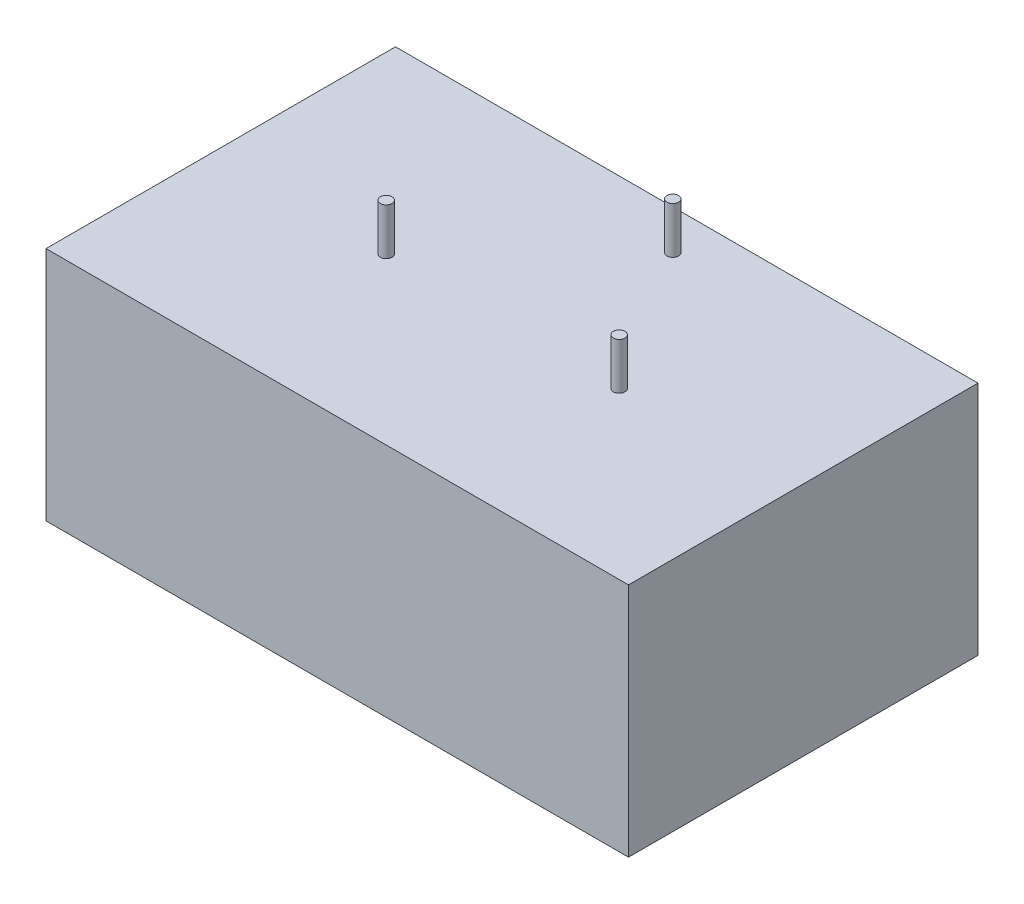
ISO-10303-21;
HEADER;
FILE_DESCRIPTION(('STEP AP214'),'2;1');
FILE_NAME('part.step','',(''),(''),'','','');
FILE_SCHEMA(('AUTOMOTIVE_DESIGN { 1 0 10303 214 1 1 1 1 }'));
ENDSEC;
DATA;
#1=APPLICATION_CONTEXT('core data for automotive mechanical design processes');
#2=APPLICATION_PROTOCOL_DEFINITION('international standard','automotive_design',2000,#1);
#3=PRODUCT_CONTEXT('',#1,'mechanical');
#4=PRODUCT('Part','Part','',(#3));
#5=PRODUCT_RELATED_PRODUCT_CATEGORY('part','',(#4));
#6=PRODUCT_DEFINITION_FORMATION('','',#4);
#7=PRODUCT_DEFINITION_CONTEXT('part definition',#1,'design');
#8=PRODUCT_DEFINITION('design','',#6,#7);
#9=PRODUCT_DEFINITION_SHAPE('','',#8);
#10=(LENGTH_UNIT() NAMED_UNIT(*) SI_UNIT(.MILLI.,.METRE.));
#11=(NAMED_UNIT(*) PLANE_ANGLE_UNIT() SI_UNIT($,.RADIAN.));
#12=(NAMED_UNIT(*) SI_UNIT($,.STERADIAN.) SOLID_ANGLE_UNIT());
#13=UNCERTAINTY_MEASURE_WITH_UNIT(LENGTH_MEASURE(1.E-05),#10,'distance_accuracy_value','');
#14=(GEOMETRIC_REPRESENTATION_CONTEXT(3) GLOBAL_UNCERTAINTY_ASSIGNED_CONTEXT((#13)) GLOBAL_UNIT_ASSIGNED_CONTEXT((#10,
#11,#12)) REPRESENTATION_CONTEXT('',''));
#15=CARTESIAN_POINT('',(0.,0.,0.));
#16=DIRECTION('',(0.,0.,1.));
#17=DIRECTION('',(1.,0.,0.));
#18=AXIS2_PLACEMENT_3D('',#15,#16,#17);
#19=CARTESIAN_POINT('',(125.,80.07,-75.));
#20=DIRECTION('',(-1.,0.,0.));
#21=DIRECTION('',(0.,0.,1.));
#22=AXIS2_PLACEMENT_3D('',#19,#20,#21);
#23=PLANE('',#22);
#24=DIRECTION('',(0.,0.,-1.));
#25=VECTOR('',#24,1.);
#26=CARTESIAN_POINT('',(125.,0.,-75.));
#27=LINE('',#26,#25);
#28=CARTESIAN_POINT('',(125.,0.,75.));
#29=VERTEX_POINT('',#28);
#30=CARTESIAN_POINT('',(125.,0.,-75.));
#31=VERTEX_POINT('',#30);
#32=EDGE_CURVE('E116',#29,#31,#27,.T.);
#33=ORIENTED_EDGE('',*,*,#32,.T.);
#34=DIRECTION('',(0.,-1.,0.));
#35=VECTOR('',#34,1.);
#36=CARTESIAN_POINT('',(125.,80.07,-75.));
#37=LINE('',#36,#35);
#38=CARTESIAN_POINT('',(125.,101.22,-75.));
#39=VERTEX_POINT('',#38);
#40=EDGE_CURVE('E11',#39,#31,#37,.T.);
#41=ORIENTED_EDGE('',*,*,#40,.F.);
#42=DIRECTION('',(0.,0.,-1.));
#43=VECTOR('',#42,1.);
#44=CARTESIAN_POINT('',(125.,101.22,75.));
#45=LINE('',#44,#43);
#46=CARTESIAN_POINT('',(125.,101.22,75.));
#47=VERTEX_POINT('',#46);
#48=EDGE_CURVE('E93',#47,#39,#45,.T.);
#49=ORIENTED_EDGE('',*,*,#48,.F.);
#50=DIRECTION('',(0.,-1.,0.));
#51=VECTOR('',#50,1.);
#52=CARTESIAN_POINT('',(125.,80.07,75.));
#53=LINE('',#52,#51);
#54=EDGE_CURVE('E82',#47,#29,#53,.T.);
#55=ORIENTED_EDGE('',*,*,#54,.T.);
#56=EDGE_LOOP('',(#33,#41,#49,#55));
#57=FACE_BOUND('',#56,.T.);
#58=ADVANCED_FACE('F43',(#57),#23,.F.);
#59=CARTESIAN_POINT('',(-125.,80.07,-75.));
#60=DIRECTION('',(0.,0.,1.));
#61=DIRECTION('',(1.,0.,0.));
#62=AXIS2_PLACEMENT_3D('',#59,#60,#61);
#63=PLANE('',#62);
#64=CARTESIAN_POINT('',(22.5,40.035,-75.));
#65=DIRECTION('',(0.,0.,-1.));
#66=DIRECTION('',(-1.,0.,0.));
#67=AXIS2_PLACEMENT_3D('',#64,#65,#66);
#68=CIRCLE('',#67,7.5);
#69=CARTESIAN_POINT('',(15.,40.035,-75.));
#70=VERTEX_POINT('',#69);
#71=EDGE_CURVE('E117',#70,#70,#68,.T.);
#72=ORIENTED_EDGE('',*,*,#71,.F.);
#73=EDGE_LOOP('',(#72));
#74=FACE_BOUND('',#73,.T.);
#75=CARTESIAN_POINT('',(-22.5,40.035,-75.));
#76=DIRECTION('',(0.,0.,-1.));
#77=DIRECTION('',(-1.,0.,0.));
#78=AXIS2_PLACEMENT_3D('',#75,#76,#77);
#79=CIRCLE('',#78,7.5);
#80=CARTESIAN_POINT('',(-30.,40.035,-75.));
#81=VERTEX_POINT('',#80);
#82=EDGE_CURVE('E120',#81,#81,#79,.T.);
#83=ORIENTED_EDGE('',*,*,#82,.F.);
#84=EDGE_LOOP('',(#83));
#85=FACE_BOUND('',#84,.T.);
#86=DIRECTION('',(-1.,0.,0.));
#87=VECTOR('',#86,1.);
#88=CARTESIAN_POINT('',(-125.,0.,-75.));
#89=LINE('',#88,#87);
#90=CARTESIAN_POINT('',(-125.,0.,-75.));
#91=VERTEX_POINT('',#90);
#92=EDGE_CURVE('E126',#31,#91,#89,.T.);
#93=ORIENTED_EDGE('',*,*,#92,.T.);
#94=DIRECTION('',(0.,-1.,0.));
#95=VECTOR('',#94,1.);
#96=CARTESIAN_POINT('',(-125.,80.07,-75.));
#97=LINE('',#96,#95);
#98=CARTESIAN_POINT('',(-125.,101.22,-75.));
#99=VERTEX_POINT('',#98);
#100=EDGE_CURVE('E50',#99,#91,#97,.T.);
#101=ORIENTED_EDGE('',*,*,#100,.F.);
#102=DIRECTION('',(-1.,0.,0.));
#103=VECTOR('',#102,1.);
#104=CARTESIAN_POINT('',(125.,101.22,-75.));
#105=LINE('',#104,#103);
#106=EDGE_CURVE('E97',#39,#99,#105,.T.);
#107=ORIENTED_EDGE('',*,*,#106,.F.);
#108=ORIENTED_EDGE('',*,*,#40,.T.);
#109=EDGE_LOOP('',(#93,#101,#107,#108));
#110=FACE_BOUND('',#109,.T.);
#111=ADVANCED_FACE('F134',(#74,#85,#110),#63,.F.);
#112=CARTESIAN_POINT('',(-125.,80.07,-75.));
#113=DIRECTION('',(1.,0.,0.));
#114=DIRECTION('',(0.,0.,-1.));
#115=AXIS2_PLACEMENT_3D('',#112,#113,#114);
#116=PLANE('',#115);
#117=DIRECTION('',(0.,0.,1.));
#118=VECTOR('',#117,1.);
#119=CARTESIAN_POINT('',(-125.,0.,-75.));
#120=LINE('',#119,#118);
#121=CARTESIAN_POINT('',(-125.,0.,75.));
#122=VERTEX_POINT('',#121);
#123=EDGE_CURVE('E65',#91,#122,#120,.T.);
#124=ORIENTED_EDGE('',*,*,#123,.T.);
#125=DIRECTION('',(0.,-1.,0.));
#126=VECTOR('',#125,1.);
#127=CARTESIAN_POINT('',(-125.,80.07,75.));
#128=LINE('',#127,#126);
#129=CARTESIAN_POINT('',(-125.,101.22,75.));
#130=VERTEX_POINT('',#129);
#131=EDGE_CURVE('E90',#130,#122,#128,.T.);
#132=ORIENTED_EDGE('',*,*,#131,.F.);
#133=DIRECTION('',(0.,0.,1.));
#134=VECTOR('',#133,1.);
#135=CARTESIAN_POINT('',(-125.,101.22,-75.));
#136=LINE('',#135,#134);
#137=EDGE_CURVE('E102',#99,#130,#136,.T.);
#138=ORIENTED_EDGE('',*,*,#137,.F.);
#139=ORIENTED_EDGE('',*,*,#100,.T.);
#140=EDGE_LOOP('',(#124,#132,#138,#139));
#141=FACE_BOUND('',#140,.T.);
#142=ADVANCED_FACE('F130',(#141),#116,.F.);
#143=CARTESIAN_POINT('',(-125.,80.07,75.));
#144=DIRECTION('',(0.,0.,-1.));
#145=DIRECTION('',(-1.,0.,0.));
#146=AXIS2_PLACEMENT_3D('',#143,#144,#145);
#147=PLANE('',#146);
#148=DIRECTION('',(1.,0.,0.));
#149=VECTOR('',#148,1.);
#150=CARTESIAN_POINT('',(-125.,0.,75.));
#151=LINE('',#150,#149);
#152=EDGE_CURVE('E57',#122,#29,#151,.T.);
#153=ORIENTED_EDGE('',*,*,#152,.T.);
#154=ORIENTED_EDGE('',*,*,#54,.F.);
#155=DIRECTION('',(1.,0.,0.));
#156=VECTOR('',#155,1.);
#157=CARTESIAN_POINT('',(-125.,101.22,75.));
#158=LINE('',#157,#156);
#159=EDGE_CURVE('E86',#130,#47,#158,.T.);
#160=ORIENTED_EDGE('',*,*,#159,.F.);
#161=ORIENTED_EDGE('',*,*,#131,.T.);
#162=EDGE_LOOP('',(#153,#154,#160,#161));
#163=FACE_BOUND('',#162,.T.);
#164=ADVANCED_FACE('F84',(#163),#147,.F.);
#165=CARTESIAN_POINT('',(0.,0.,0.));
#166=DIRECTION('',(0.,1.,0.));
#167=DIRECTION('',(0.,0.,1.));
#168=AXIS2_PLACEMENT_3D('',#165,#166,#167);
#169=PLANE('',#168);
#170=ORIENTED_EDGE('',*,*,#32,.F.);
#171=ORIENTED_EDGE('',*,*,#152,.F.);
#172=ORIENTED_EDGE('',*,*,#123,.F.);
#173=ORIENTED_EDGE('',*,*,#92,.F.);
#174=EDGE_LOOP('',(#170,#171,#172,#173));
#175=FACE_BOUND('',#174,.T.);
#176=ADVANCED_FACE('F133',(#175),#169,.F.);
#177=CARTESIAN_POINT('',(-22.5,40.035,-55.));
#178=DIRECTION('',(0.,0.,-1.));
#179=DIRECTION('',(-1.,0.,0.));
#180=AXIS2_PLACEMENT_3D('',#177,#178,#179);
#181=CYLINDRICAL_SURFACE('',#180,7.5);
#182=CARTESIAN_POINT('',(-22.5,40.035,-55.));
#183=DIRECTION('',(0.,0.,-1.));
#184=DIRECTION('',(-1.,0.,0.));
#185=AXIS2_PLACEMENT_3D('',#182,#183,#184);
#186=CIRCLE('',#185,7.5);
#187=CARTESIAN_POINT('',(-30.,40.035,-55.));
#188=VERTEX_POINT('',#187);
#189=EDGE_CURVE('E112',#188,#188,#186,.T.);
#190=ORIENTED_EDGE('',*,*,#189,.F.);
#191=EDGE_LOOP('',(#190));
#192=FACE_BOUND('',#191,.T.);
#193=ORIENTED_EDGE('',*,*,#82,.T.);
#194=EDGE_LOOP('',(#193));
#195=FACE_BOUND('',#194,.T.);
#196=ADVANCED_FACE('F149',(#192,#195),#181,.F.);
#197=CARTESIAN_POINT('',(-22.5,40.035,-55.));
#198=DIRECTION('',(0.,0.,-1.));
#199=DIRECTION('',(-1.,0.,0.));
#200=AXIS2_PLACEMENT_3D('',#197,#198,#199);
#201=PLANE('',#200);
#202=ORIENTED_EDGE('',*,*,#189,.T.);
#203=EDGE_LOOP('',(#202));
#204=FACE_BOUND('',#203,.T.);
#205=ADVANCED_FACE('F150',(#204),#201,.T.);
#206=CARTESIAN_POINT('',(22.5,40.035,-55.));
#207=DIRECTION('',(0.,0.,-1.));
#208=DIRECTION('',(-1.,0.,0.));
#209=AXIS2_PLACEMENT_3D('',#206,#207,#208);
#210=CYLINDRICAL_SURFACE('',#209,7.5);
#211=CARTESIAN_POINT('',(22.5,40.035,-55.));
#212=DIRECTION('',(0.,0.,-1.));
#213=DIRECTION('',(-1.,0.,0.));
#214=AXIS2_PLACEMENT_3D('',#211,#212,#213);
#215=CIRCLE('',#214,7.5);
#216=CARTESIAN_POINT('',(15.,40.035,-55.));
#217=VERTEX_POINT('',#216);
#218=EDGE_CURVE('E113',#217,#217,#215,.T.);
#219=ORIENTED_EDGE('',*,*,#218,.F.);
#220=EDGE_LOOP('',(#219));
#221=FACE_BOUND('',#220,.T.);
#222=ORIENTED_EDGE('',*,*,#71,.T.);
#223=EDGE_LOOP('',(#222));
#224=FACE_BOUND('',#223,.T.);
#225=ADVANCED_FACE('F153',(#221,#224),#210,.F.);
#226=CARTESIAN_POINT('',(22.5,40.035,-55.));
#227=DIRECTION('',(0.,0.,-1.));
#228=DIRECTION('',(-1.,0.,0.));
#229=AXIS2_PLACEMENT_3D('',#226,#227,#228);
#230=PLANE('',#229);
#231=ORIENTED_EDGE('',*,*,#218,.T.);
#232=EDGE_LOOP('',(#231));
#233=FACE_BOUND('',#232,.T.);
#234=ADVANCED_FACE('F160',(#233),#230,.T.);
#235=CARTESIAN_POINT('',(0.,101.22,0.));
#236=DIRECTION('',(0.,1.,0.));
#237=DIRECTION('',(0.,0.,1.));
#238=AXIS2_PLACEMENT_3D('',#235,#236,#237);
#239=PLANE('',#238);
#240=CARTESIAN_POINT('',(-50.,101.22,4.));
#241=DIRECTION('',(0.,1.,0.));
#242=DIRECTION('',(0.,0.,-1.));
#243=AXIS2_PLACEMENT_3D('',#240,#241,#242);
#244=CIRCLE('',#243,2.49999999999999);
#245=CARTESIAN_POINT('',(-50.,101.22,1.50000000000001));
#246=VERTEX_POINT('',#245);
#247=EDGE_CURVE('E199',#246,#246,#244,.T.);
#248=ORIENTED_EDGE('',*,*,#247,.F.);
#249=EDGE_LOOP('',(#248));
#250=FACE_BOUND('',#249,.T.);
#251=CARTESIAN_POINT('',(50.,101.22,4.));
#252=DIRECTION('',(0.,1.,0.));
#253=DIRECTION('',(0.,0.,1.));
#254=AXIS2_PLACEMENT_3D('',#251,#252,#253);
#255=CIRCLE('',#254,2.49999999999999);
#256=CARTESIAN_POINT('',(50.,101.22,6.5));
#257=VERTEX_POINT('',#256);
#258=EDGE_CURVE('E200',#257,#257,#255,.T.);
#259=ORIENTED_EDGE('',*,*,#258,.F.);
#260=EDGE_LOOP('',(#259));
#261=FACE_BOUND('',#260,.T.);
#262=CARTESIAN_POINT('',(11.,101.22,-58.));
#263=DIRECTION('',(0.,1.,0.));
#264=DIRECTION('',(0.,0.,1.));
#265=AXIS2_PLACEMENT_3D('',#262,#263,#264);
#266=CIRCLE('',#265,2.50000000000057);
#267=CARTESIAN_POINT('',(11.,101.22,-55.4999999999994));
#268=VERTEX_POINT('',#267);
#269=EDGE_CURVE('E106',#268,#268,#266,.T.);
#270=ORIENTED_EDGE('',*,*,#269,.F.);
#271=EDGE_LOOP('',(#270));
#272=FACE_BOUND('',#271,.T.);
#273=ORIENTED_EDGE('',*,*,#159,.T.);
#274=ORIENTED_EDGE('',*,*,#48,.T.);
#275=ORIENTED_EDGE('',*,*,#106,.T.);
#276=ORIENTED_EDGE('',*,*,#137,.T.);
#277=EDGE_LOOP('',(#273,#274,#275,#276));
#278=FACE_BOUND('',#277,.T.);
#279=ADVANCED_FACE('F100',(#250,#261,#272,#278),#239,.T.);
#280=CARTESIAN_POINT('',(11.,121.22,-58.));
#281=DIRECTION('',(0.,-1.,0.));
#282=DIRECTION('',(0.,0.,-1.));
#283=AXIS2_PLACEMENT_3D('',#280,#281,#282);
#284=CYLINDRICAL_SURFACE('',#283,2.50000000000057);
#285=CARTESIAN_POINT('',(11.,121.22,-58.));
#286=DIRECTION('',(0.,1.,0.));
#287=DIRECTION('',(0.,0.,1.));
#288=AXIS2_PLACEMENT_3D('',#285,#286,#287);
#289=CIRCLE('',#288,2.50000000000057);
#290=CARTESIAN_POINT('',(11.,121.22,-55.4999999999994));
#291=VERTEX_POINT('',#290);
#292=EDGE_CURVE('E103',#291,#291,#289,.T.);
#293=ORIENTED_EDGE('',*,*,#292,.F.);
#294=EDGE_LOOP('',(#293));
#295=FACE_BOUND('',#294,.T.);
#296=ORIENTED_EDGE('',*,*,#269,.T.);
#297=EDGE_LOOP('',(#296));
#298=FACE_BOUND('',#297,.T.);
#299=ADVANCED_FACE('F167',(#295,#298),#284,.T.);
#300=CARTESIAN_POINT('',(11.,121.22,-58.));
#301=DIRECTION('',(0.,1.,0.));
#302=DIRECTION('',(0.,0.,1.));
#303=AXIS2_PLACEMENT_3D('',#300,#301,#302);
#304=PLANE('',#303);
#305=ORIENTED_EDGE('',*,*,#292,.T.);
#306=EDGE_LOOP('',(#305));
#307=FACE_BOUND('',#306,.T.);
#308=ADVANCED_FACE('F171',(#307),#304,.T.);
#309=CARTESIAN_POINT('',(50.,121.22,4.));
#310=DIRECTION('',(0.,-1.,0.));
#311=DIRECTION('',(0.,0.,-1.));
#312=AXIS2_PLACEMENT_3D('',#309,#310,#311);
#313=CYLINDRICAL_SURFACE('',#312,2.49999999999999);
#314=CARTESIAN_POINT('',(50.,121.22,4.));
#315=DIRECTION('',(0.,1.,0.));
#316=DIRECTION('',(0.,0.,1.));
#317=AXIS2_PLACEMENT_3D('',#314,#315,#316);
#318=CIRCLE('',#317,2.49999999999999);
#319=CARTESIAN_POINT('',(50.,121.22,6.5));
#320=VERTEX_POINT('',#319);
#321=EDGE_CURVE('E203',#320,#320,#318,.T.);
#322=ORIENTED_EDGE('',*,*,#321,.F.);
#323=EDGE_LOOP('',(#322));
#324=FACE_BOUND('',#323,.T.);
#325=ORIENTED_EDGE('',*,*,#258,.T.);
#326=EDGE_LOOP('',(#325));
#327=FACE_BOUND('',#326,.T.);
#328=ADVANCED_FACE('F175',(#324,#327),#313,.T.);
#329=CARTESIAN_POINT('',(50.,121.22,4.));
#330=DIRECTION('',(0.,1.,0.));
#331=DIRECTION('',(0.,0.,1.));
#332=AXIS2_PLACEMENT_3D('',#329,#330,#331);
#333=PLANE('',#332);
#334=ORIENTED_EDGE('',*,*,#321,.T.);
#335=EDGE_LOOP('',(#334));
#336=FACE_BOUND('',#335,.T.);
#337=ADVANCED_FACE('F179',(#336),#333,.T.);
#338=CARTESIAN_POINT('',(-50.,121.22,4.));
#339=DIRECTION('',(0.,-1.,0.));
#340=DIRECTION('',(0.,0.,-1.));
#341=AXIS2_PLACEMENT_3D('',#338,#339,#340);
#342=CYLINDRICAL_SURFACE('',#341,2.49999999999999);
#343=CARTESIAN_POINT('',(-50.,121.22,4.));
#344=DIRECTION('',(0.,1.,0.));
#345=DIRECTION('',(0.,0.,-1.));
#346=AXIS2_PLACEMENT_3D('',#343,#344,#345);
#347=CIRCLE('',#346,2.49999999999999);
#348=CARTESIAN_POINT('',(-50.,121.22,1.50000000000001));
#349=VERTEX_POINT('',#348);
#350=EDGE_CURVE('E196',#349,#349,#347,.T.);
#351=ORIENTED_EDGE('',*,*,#350,.F.);
#352=EDGE_LOOP('',(#351));
#353=FACE_BOUND('',#352,.T.);
#354=ORIENTED_EDGE('',*,*,#247,.T.);
#355=EDGE_LOOP('',(#354));
#356=FACE_BOUND('',#355,.T.);
#357=ADVANCED_FACE('F183',(#353,#356),#342,.T.);
#358=CARTESIAN_POINT('',(-50.,121.22,4.));
#359=DIRECTION('',(0.,-1.,0.));
#360=DIRECTION('',(0.,0.,-1.));
#361=AXIS2_PLACEMENT_3D('',#358,#359,#360);
#362=PLANE('',#361);
#363=ORIENTED_EDGE('',*,*,#350,.T.);
#364=EDGE_LOOP('',(#363));
#365=FACE_BOUND('',#364,.T.);
#366=ADVANCED_FACE('F185',(#365),#362,.F.);
#367=CLOSED_SHELL('',(#58,#111,#142,#164,#176,#196,#205,#225,#234,#279,#299,#308,#328,#337,#357,#366));
#368=MANIFOLD_SOLID_BREP('B2',#367);
#369=ADVANCED_BREP_SHAPE_REPRESENTATION('',(#18,#368),#14);
#370=SHAPE_DEFINITION_REPRESENTATION(#9,#369);
ENDSEC;
END-ISO-10303-21;
